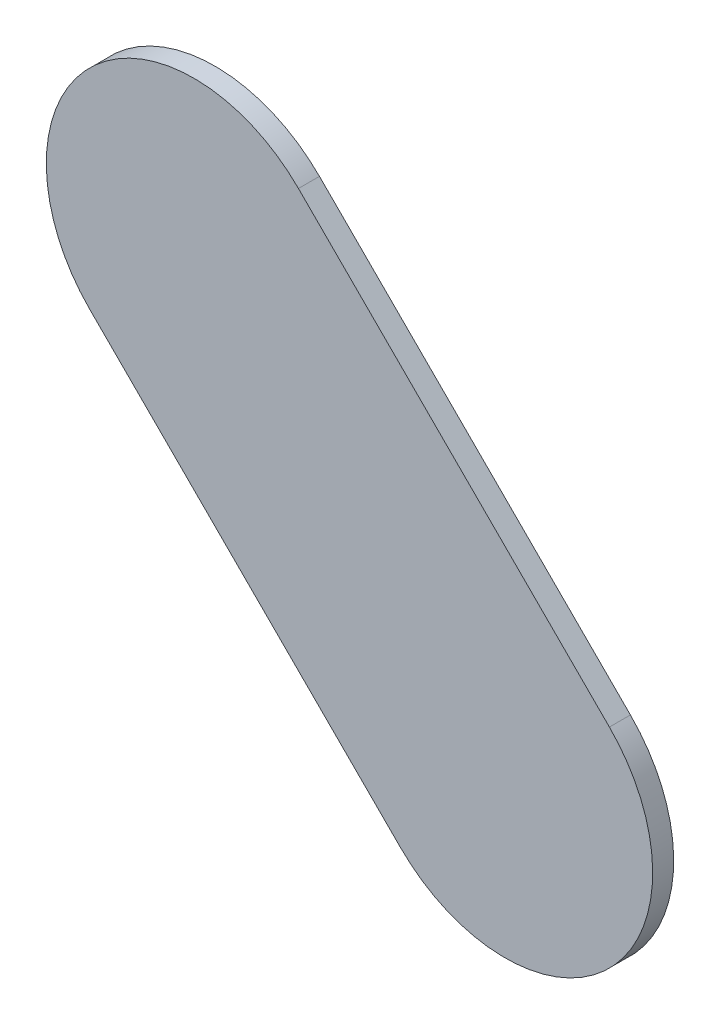
ISO-10303-21;
HEADER;
FILE_DESCRIPTION(('STEP AP214'),'2;1');
FILE_NAME('part.step','',(''),(''),'','','');
FILE_SCHEMA(('AUTOMOTIVE_DESIGN { 1 0 10303 214 1 1 1 1 }'));
ENDSEC;
DATA;
#1=APPLICATION_CONTEXT('core data for automotive mechanical design processes');
#2=APPLICATION_PROTOCOL_DEFINITION('international standard','automotive_design',2000,#1);
#3=PRODUCT_CONTEXT('',#1,'mechanical');
#4=PRODUCT('Part','Part','',(#3));
#5=PRODUCT_RELATED_PRODUCT_CATEGORY('part','',(#4));
#6=PRODUCT_DEFINITION_FORMATION('','',#4);
#7=PRODUCT_DEFINITION_CONTEXT('part definition',#1,'design');
#8=PRODUCT_DEFINITION('design','',#6,#7);
#9=PRODUCT_DEFINITION_SHAPE('','',#8);
#10=(LENGTH_UNIT() NAMED_UNIT(*) SI_UNIT(.MILLI.,.METRE.));
#11=(NAMED_UNIT(*) PLANE_ANGLE_UNIT() SI_UNIT($,.RADIAN.));
#12=(NAMED_UNIT(*) SI_UNIT($,.STERADIAN.) SOLID_ANGLE_UNIT());
#13=UNCERTAINTY_MEASURE_WITH_UNIT(LENGTH_MEASURE(1.E-05),#10,'distance_accuracy_value','');
#14=(GEOMETRIC_REPRESENTATION_CONTEXT(3) GLOBAL_UNCERTAINTY_ASSIGNED_CONTEXT((#13)) GLOBAL_UNIT_ASSIGNED_CONTEXT((#10,
#11,#12)) REPRESENTATION_CONTEXT('',''));
#15=CARTESIAN_POINT('',(0.,0.,0.));
#16=DIRECTION('',(0.,0.,1.));
#17=DIRECTION('',(1.,0.,0.));
#18=AXIS2_PLACEMENT_3D('',#15,#16,#17);
#19=CARTESIAN_POINT('',(93.65422722,92.45001322,0.));
#20=DIRECTION('',(0.707106781186557,0.707106781186538,0.));
#21=DIRECTION('',(0.707106781186538,-0.707106781186557,0.));
#22=AXIS2_PLACEMENT_3D('',#19,#20,#21);
#23=PLANE('',#22);
#24=DIRECTION('',(0.707106781186538,-0.707106781186557,0.));
#25=VECTOR('',#24,1.);
#26=CARTESIAN_POINT('',(93.65422722,92.45001322,0.03556));
#27=LINE('',#26,#25);
#28=CARTESIAN_POINT('',(93.65422722,92.45001322,0.03556));
#29=VERTEX_POINT('',#28);
#30=CARTESIAN_POINT('',(94.18061682,91.92362362,0.03556));
#31=VERTEX_POINT('',#30);
#32=EDGE_CURVE('E11',#29,#31,#27,.T.);
#33=ORIENTED_EDGE('',*,*,#32,.F.);
#34=DIRECTION('',(0.,0.,1.));
#35=VECTOR('',#34,1.);
#36=CARTESIAN_POINT('',(93.65422722,92.45001322,0.));
#37=LINE('',#36,#35);
#38=CARTESIAN_POINT('',(93.65422722,92.45001322,0.));
#39=VERTEX_POINT('',#38);
#40=EDGE_CURVE('E24',#39,#29,#37,.T.);
#41=ORIENTED_EDGE('',*,*,#40,.F.);
#42=DIRECTION('',(0.707106781186538,-0.707106781186557,0.));
#43=VECTOR('',#42,1.);
#44=CARTESIAN_POINT('',(93.65422722,92.45001322,0.));
#45=LINE('',#44,#43);
#46=CARTESIAN_POINT('',(94.18061682,91.92362362,0.));
#47=VERTEX_POINT('',#46);
#48=EDGE_CURVE('E75',#39,#47,#45,.T.);
#49=ORIENTED_EDGE('',*,*,#48,.T.);
#50=DIRECTION('',(0.,0.,1.));
#51=VECTOR('',#50,1.);
#52=CARTESIAN_POINT('',(94.18061682,91.92362362,0.));
#53=LINE('',#52,#51);
#54=EDGE_CURVE('E37',#47,#31,#53,.T.);
#55=ORIENTED_EDGE('',*,*,#54,.T.);
#56=EDGE_LOOP('',(#33,#41,#49,#55));
#57=FACE_BOUND('',#56,.T.);
#58=ADVANCED_FACE('F17',(#57),#23,.F.);
#59=CARTESIAN_POINT('',(94.3573932,92.1004,0.));
#60=DIRECTION('',(0.,0.,-1.));
#61=DIRECTION('',(-0.707106781186519,-0.707106781186576,0.));
#62=AXIS2_PLACEMENT_3D('',#59,#60,#61);
#63=CYLINDRICAL_SURFACE('',#62,0.249999554103226);
#64=CARTESIAN_POINT('',(94.3573932,92.1004,0.03556));
#65=DIRECTION('',(0.,0.,1.));
#66=DIRECTION('',(-0.707106781186519,-0.707106781186576,0.));
#67=AXIS2_PLACEMENT_3D('',#64,#65,#66);
#68=CIRCLE('',#67,0.249999554103226);
#69=CARTESIAN_POINT('',(94.53416958,92.27717638,0.03556));
#70=VERTEX_POINT('',#69);
#71=EDGE_CURVE('E83',#31,#70,#68,.T.);
#72=ORIENTED_EDGE('',*,*,#71,.F.);
#73=ORIENTED_EDGE('',*,*,#54,.F.);
#74=CARTESIAN_POINT('',(94.3573932,92.1004,0.));
#75=DIRECTION('',(0.,0.,1.));
#76=DIRECTION('',(-0.707106781186519,-0.707106781186576,0.));
#77=AXIS2_PLACEMENT_3D('',#74,#75,#76);
#78=CIRCLE('',#77,0.249999554103226);
#79=CARTESIAN_POINT('',(94.53416958,92.27717638,0.));
#80=VERTEX_POINT('',#79);
#81=EDGE_CURVE('E81',#47,#80,#78,.T.);
#82=ORIENTED_EDGE('',*,*,#81,.T.);
#83=DIRECTION('',(0.,0.,1.));
#84=VECTOR('',#83,1.);
#85=CARTESIAN_POINT('',(94.53416958,92.27717638,0.));
#86=LINE('',#85,#84);
#87=EDGE_CURVE('E67',#80,#70,#86,.T.);
#88=ORIENTED_EDGE('',*,*,#87,.T.);
#89=EDGE_LOOP('',(#72,#73,#82,#88));
#90=FACE_BOUND('',#89,.T.);
#91=ADVANCED_FACE('F89',(#90),#63,.T.);
#92=CARTESIAN_POINT('',(94.53416958,92.27717638,0.));
#93=DIRECTION('',(-0.707106781186538,-0.707106781186557,0.));
#94=DIRECTION('',(-0.707106781186557,0.707106781186538,0.));
#95=AXIS2_PLACEMENT_3D('',#92,#93,#94);
#96=PLANE('',#95);
#97=DIRECTION('',(-0.707106781186557,0.707106781186538,0.));
#98=VECTOR('',#97,1.);
#99=CARTESIAN_POINT('',(94.53416958,92.27717638,0.03556));
#100=LINE('',#99,#98);
#101=CARTESIAN_POINT('',(94.00777998,92.80356598,0.03556));
#102=VERTEX_POINT('',#101);
#103=EDGE_CURVE('E71',#70,#102,#100,.T.);
#104=ORIENTED_EDGE('',*,*,#103,.F.);
#105=ORIENTED_EDGE('',*,*,#87,.F.);
#106=DIRECTION('',(-0.707106781186557,0.707106781186538,0.));
#107=VECTOR('',#106,1.);
#108=CARTESIAN_POINT('',(94.53416958,92.27717638,0.));
#109=LINE('',#108,#107);
#110=CARTESIAN_POINT('',(94.00777998,92.80356598,0.));
#111=VERTEX_POINT('',#110);
#112=EDGE_CURVE('E63',#80,#111,#109,.T.);
#113=ORIENTED_EDGE('',*,*,#112,.T.);
#114=DIRECTION('',(0.,0.,1.));
#115=VECTOR('',#114,1.);
#116=CARTESIAN_POINT('',(94.00777998,92.80356598,0.));
#117=LINE('',#116,#115);
#118=EDGE_CURVE('E53',#111,#102,#117,.T.);
#119=ORIENTED_EDGE('',*,*,#118,.T.);
#120=EDGE_LOOP('',(#104,#105,#113,#119));
#121=FACE_BOUND('',#120,.T.);
#122=ADVANCED_FACE('F66',(#121),#96,.F.);
#123=CARTESIAN_POINT('',(93.8310036,92.6267896,0.));
#124=DIRECTION('',(0.,0.,-1.));
#125=DIRECTION('',(0.707106781186548,0.707106781186548,0.));
#126=AXIS2_PLACEMENT_3D('',#123,#124,#125);
#127=CYLINDRICAL_SURFACE('',#126,0.249999554103216);
#128=CARTESIAN_POINT('',(93.8310036,92.6267896,0.03556));
#129=DIRECTION('',(0.,0.,1.));
#130=DIRECTION('',(0.707106781186548,0.707106781186548,0.));
#131=AXIS2_PLACEMENT_3D('',#128,#129,#130);
#132=CIRCLE('',#131,0.249999554103216);
#133=EDGE_CURVE('E59',#102,#29,#132,.T.);
#134=ORIENTED_EDGE('',*,*,#133,.F.);
#135=ORIENTED_EDGE('',*,*,#118,.F.);
#136=CARTESIAN_POINT('',(93.8310036,92.6267896,0.));
#137=DIRECTION('',(0.,0.,1.));
#138=DIRECTION('',(0.707106781186548,0.707106781186548,0.));
#139=AXIS2_PLACEMENT_3D('',#136,#137,#138);
#140=CIRCLE('',#139,0.249999554103216);
#141=EDGE_CURVE('E57',#111,#39,#140,.T.);
#142=ORIENTED_EDGE('',*,*,#141,.T.);
#143=ORIENTED_EDGE('',*,*,#40,.T.);
#144=EDGE_LOOP('',(#134,#135,#142,#143));
#145=FACE_BOUND('',#144,.T.);
#146=ADVANCED_FACE('F55',(#145),#127,.T.);
#147=CARTESIAN_POINT('',(93.65422722,92.45001322,0.));
#148=DIRECTION('',(0.,0.,-1.));
#149=DIRECTION('',(-1.,0.,0.));
#150=AXIS2_PLACEMENT_3D('',#147,#148,#149);
#151=PLANE('',#150);
#152=ORIENTED_EDGE('',*,*,#141,.F.);
#153=ORIENTED_EDGE('',*,*,#112,.F.);
#154=ORIENTED_EDGE('',*,*,#81,.F.);
#155=ORIENTED_EDGE('',*,*,#48,.F.);
#156=EDGE_LOOP('',(#152,#153,#154,#155));
#157=FACE_BOUND('',#156,.T.);
#158=ADVANCED_FACE('F74',(#157),#151,.T.);
#159=CARTESIAN_POINT('',(93.65422722,92.45001322,0.03556));
#160=DIRECTION('',(0.,0.,-1.));
#161=DIRECTION('',(-1.,0.,0.));
#162=AXIS2_PLACEMENT_3D('',#159,#160,#161);
#163=PLANE('',#162);
#164=ORIENTED_EDGE('',*,*,#32,.T.);
#165=ORIENTED_EDGE('',*,*,#71,.T.);
#166=ORIENTED_EDGE('',*,*,#103,.T.);
#167=ORIENTED_EDGE('',*,*,#133,.T.);
#168=EDGE_LOOP('',(#164,#165,#166,#167));
#169=FACE_BOUND('',#168,.T.);
#170=ADVANCED_FACE('F91',(#169),#163,.F.);
#171=CLOSED_SHELL('',(#58,#91,#122,#146,#158,#170));
#172=MANIFOLD_SOLID_BREP('B1',#171);
#173=ADVANCED_BREP_SHAPE_REPRESENTATION('',(#18,#172),#14);
#174=SHAPE_DEFINITION_REPRESENTATION(#9,#173);
ENDSEC;
END-ISO-10303-21;
